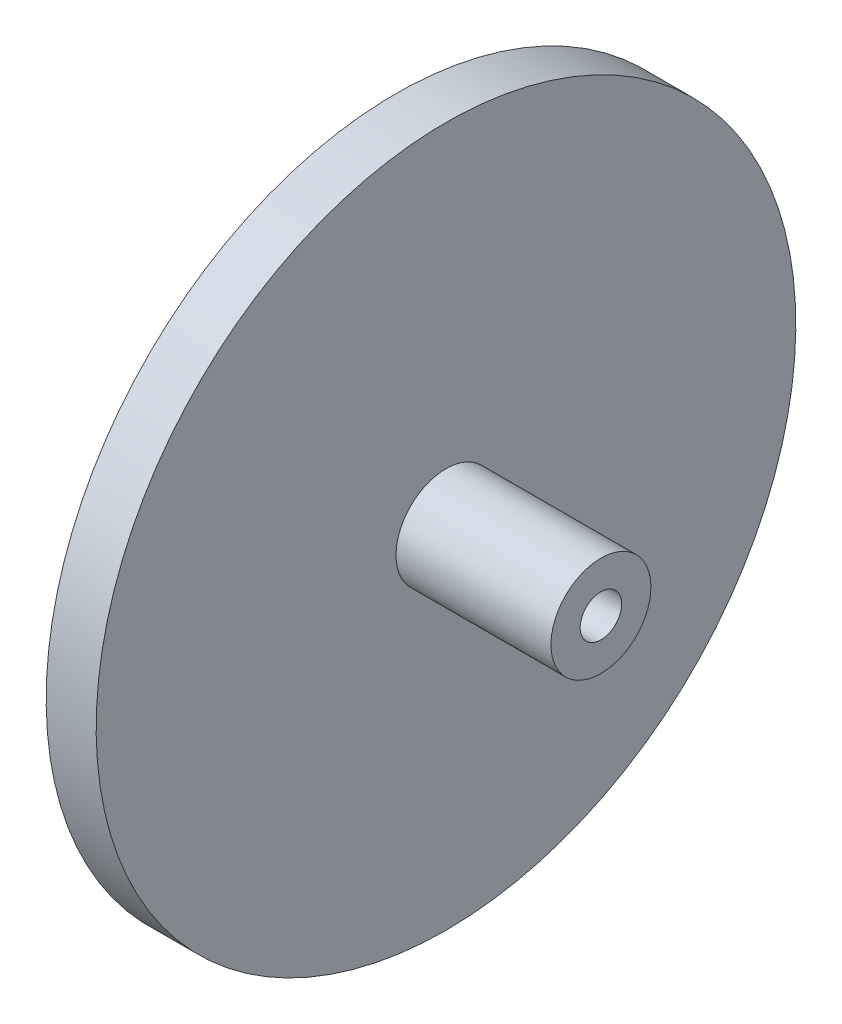
ISO-10303-21;
HEADER;
FILE_DESCRIPTION(('STEP AP214'),'2;1');
FILE_NAME('part.step','',(''),(''),'','','');
FILE_SCHEMA(('AUTOMOTIVE_DESIGN { 1 0 10303 214 1 1 1 1 }'));
ENDSEC;
DATA;
#1=APPLICATION_CONTEXT('core data for automotive mechanical design processes');
#2=APPLICATION_PROTOCOL_DEFINITION('international standard','automotive_design',2000,#1);
#3=PRODUCT_CONTEXT('',#1,'mechanical');
#4=PRODUCT('Part','Part','',(#3));
#5=PRODUCT_RELATED_PRODUCT_CATEGORY('part','',(#4));
#6=PRODUCT_DEFINITION_FORMATION('','',#4);
#7=PRODUCT_DEFINITION_CONTEXT('part definition',#1,'design');
#8=PRODUCT_DEFINITION('design','',#6,#7);
#9=PRODUCT_DEFINITION_SHAPE('','',#8);
#10=(LENGTH_UNIT() NAMED_UNIT(*) SI_UNIT(.MILLI.,.METRE.));
#11=(NAMED_UNIT(*) PLANE_ANGLE_UNIT() SI_UNIT($,.RADIAN.));
#12=(NAMED_UNIT(*) SI_UNIT($,.STERADIAN.) SOLID_ANGLE_UNIT());
#13=UNCERTAINTY_MEASURE_WITH_UNIT(LENGTH_MEASURE(1.E-05),#10,'distance_accuracy_value','');
#14=(GEOMETRIC_REPRESENTATION_CONTEXT(3) GLOBAL_UNCERTAINTY_ASSIGNED_CONTEXT((#13)) GLOBAL_UNIT_ASSIGNED_CONTEXT((#10,
#11,#12)) REPRESENTATION_CONTEXT('',''));
#15=CARTESIAN_POINT('',(0.,0.,0.));
#16=DIRECTION('',(0.,0.,1.));
#17=DIRECTION('',(1.,0.,0.));
#18=AXIS2_PLACEMENT_3D('',#15,#16,#17);
#19=CARTESIAN_POINT('',(41.91,44.45,0.));
#20=DIRECTION('',(1.,0.,0.));
#21=DIRECTION('',(0.,1.,0.));
#22=AXIS2_PLACEMENT_3D('',#19,#20,#21);
#23=PLANE('',#22);
#24=CARTESIAN_POINT('',(41.91,0.,0.));
#25=DIRECTION('',(1.,0.,0.));
#26=DIRECTION('',(0.,1.,0.));
#27=AXIS2_PLACEMENT_3D('',#24,#25,#26);
#28=CIRCLE('',#27,2.6416);
#29=CARTESIAN_POINT('',(41.91,2.6416,0.));
#30=VERTEX_POINT('',#29);
#31=EDGE_CURVE('E60',#30,#30,#28,.T.);
#32=ORIENTED_EDGE('',*,*,#31,.T.);
#33=EDGE_LOOP('',(#32));
#34=FACE_BOUND('',#33,.T.);
#35=CARTESIAN_POINT('',(41.91,0.,0.));
#36=DIRECTION('',(-1.,0.,0.));
#37=DIRECTION('',(0.,-1.,0.));
#38=AXIS2_PLACEMENT_3D('',#35,#36,#37);
#39=CIRCLE('',#38,44.45);
#40=CARTESIAN_POINT('',(41.91,-44.45,0.));
#41=VERTEX_POINT('',#40);
#42=EDGE_CURVE('E10',#41,#41,#39,.T.);
#43=ORIENTED_EDGE('',*,*,#42,.T.);
#44=EDGE_LOOP('',(#43));
#45=FACE_BOUND('',#44,.T.);
#46=ADVANCED_FACE('F37',(#34,#45),#23,.F.);
#47=CARTESIAN_POINT('',(41.91,0.,0.));
#48=DIRECTION('',(-1.,0.,0.));
#49=DIRECTION('',(0.,-1.,0.));
#50=AXIS2_PLACEMENT_3D('',#47,#48,#49);
#51=CYLINDRICAL_SURFACE('',#50,44.45);
#52=ORIENTED_EDGE('',*,*,#42,.F.);
#53=EDGE_LOOP('',(#52));
#54=FACE_BOUND('',#53,.T.);
#55=CARTESIAN_POINT('',(48.26,0.,0.));
#56=DIRECTION('',(-1.,0.,0.));
#57=DIRECTION('',(0.,-1.,0.));
#58=AXIS2_PLACEMENT_3D('',#55,#56,#57);
#59=CIRCLE('',#58,44.45);
#60=CARTESIAN_POINT('',(48.26,-44.45,0.));
#61=VERTEX_POINT('',#60);
#62=EDGE_CURVE('E44',#61,#61,#59,.T.);
#63=ORIENTED_EDGE('',*,*,#62,.T.);
#64=EDGE_LOOP('',(#63));
#65=FACE_BOUND('',#64,.T.);
#66=ADVANCED_FACE('F90',(#54,#65),#51,.T.);
#67=CARTESIAN_POINT('',(48.26,44.45,0.));
#68=DIRECTION('',(-1.,0.,0.));
#69=DIRECTION('',(0.,-1.,0.));
#70=AXIS2_PLACEMENT_3D('',#67,#68,#69);
#71=PLANE('',#70);
#72=ORIENTED_EDGE('',*,*,#62,.F.);
#73=EDGE_LOOP('',(#72));
#74=FACE_BOUND('',#73,.T.);
#75=CARTESIAN_POINT('',(48.26,0.,0.));
#76=DIRECTION('',(-1.,0.,0.));
#77=DIRECTION('',(0.,-1.,0.));
#78=AXIS2_PLACEMENT_3D('',#75,#76,#77);
#79=CIRCLE('',#78,6.35000000000002);
#80=CARTESIAN_POINT('',(48.26,-6.35000000000002,0.));
#81=VERTEX_POINT('',#80);
#82=EDGE_CURVE('E49',#81,#81,#79,.T.);
#83=ORIENTED_EDGE('',*,*,#82,.T.);
#84=EDGE_LOOP('',(#83));
#85=FACE_BOUND('',#84,.T.);
#86=ADVANCED_FACE('F84',(#74,#85),#71,.F.);
#87=CARTESIAN_POINT('',(41.91,0.,0.));
#88=DIRECTION('',(-1.,0.,0.));
#89=DIRECTION('',(0.,-1.,0.));
#90=AXIS2_PLACEMENT_3D('',#87,#88,#89);
#91=CYLINDRICAL_SURFACE('',#90,6.35000000000002);
#92=ORIENTED_EDGE('',*,*,#82,.F.);
#93=EDGE_LOOP('',(#92));
#94=FACE_BOUND('',#93,.T.);
#95=CARTESIAN_POINT('',(67.945,0.,0.));
#96=DIRECTION('',(-1.,0.,0.));
#97=DIRECTION('',(0.,-1.,0.));
#98=AXIS2_PLACEMENT_3D('',#95,#96,#97);
#99=CIRCLE('',#98,6.35000000000002);
#100=CARTESIAN_POINT('',(67.945,-6.35000000000002,0.));
#101=VERTEX_POINT('',#100);
#102=EDGE_CURVE('E54',#101,#101,#99,.T.);
#103=ORIENTED_EDGE('',*,*,#102,.T.);
#104=EDGE_LOOP('',(#103));
#105=FACE_BOUND('',#104,.T.);
#106=ADVANCED_FACE('F79',(#94,#105),#91,.T.);
#107=CARTESIAN_POINT('',(67.945,6.35000000000003,0.));
#108=DIRECTION('',(-1.,0.,0.));
#109=DIRECTION('',(0.,-1.,0.));
#110=AXIS2_PLACEMENT_3D('',#107,#108,#109);
#111=PLANE('',#110);
#112=CARTESIAN_POINT('',(67.945,0.,0.));
#113=DIRECTION('',(1.,0.,0.));
#114=DIRECTION('',(0.,1.,0.));
#115=AXIS2_PLACEMENT_3D('',#112,#113,#114);
#116=CIRCLE('',#115,2.6416);
#117=CARTESIAN_POINT('',(67.945,2.6416,0.));
#118=VERTEX_POINT('',#117);
#119=EDGE_CURVE('E61',#118,#118,#116,.T.);
#120=ORIENTED_EDGE('',*,*,#119,.F.);
#121=EDGE_LOOP('',(#120));
#122=FACE_BOUND('',#121,.T.);
#123=ORIENTED_EDGE('',*,*,#102,.F.);
#124=EDGE_LOOP('',(#123));
#125=FACE_BOUND('',#124,.T.);
#126=ADVANCED_FACE('F73',(#122,#125),#111,.F.);
#127=CARTESIAN_POINT('',(41.91,0.,0.));
#128=DIRECTION('',(1.,0.,0.));
#129=DIRECTION('',(0.,1.,0.));
#130=AXIS2_PLACEMENT_3D('',#127,#128,#129);
#131=CYLINDRICAL_SURFACE('',#130,2.6416);
#132=CARTESIAN_POINT('',(41.91,2.6416,0.));
#133=CARTESIAN_POINT('',(42.1811979166666,2.6416,0.));
#134=CARTESIAN_POINT('',(42.4523958333333,2.6416,0.));
#135=CARTESIAN_POINT('',(42.9947916666666,2.6416,0.));
#136=CARTESIAN_POINT('',(43.2659895833333,2.6416,0.));
#137=CARTESIAN_POINT('',(43.8083854166666,2.6416,0.));
#138=CARTESIAN_POINT('',(44.0795833333333,2.6416,0.));
#139=CARTESIAN_POINT('',(44.6219791666666,2.6416,0.));
#140=CARTESIAN_POINT('',(44.8931770833333,2.6416,0.));
#141=CARTESIAN_POINT('',(45.4355729166666,2.6416,0.));
#142=CARTESIAN_POINT('',(45.7067708333333,2.6416,0.));
#143=CARTESIAN_POINT('',(46.2491666666666,2.6416,0.));
#144=CARTESIAN_POINT('',(46.5203645833333,2.6416,0.));
#145=CARTESIAN_POINT('',(47.0627604166666,2.6416,0.));
#146=CARTESIAN_POINT('',(47.3339583333333,2.6416,0.));
#147=CARTESIAN_POINT('',(47.8763541666667,2.6416,0.));
#148=CARTESIAN_POINT('',(48.1475520833333,2.6416,0.));
#149=CARTESIAN_POINT('',(48.6899479166666,2.6416,0.));
#150=CARTESIAN_POINT('',(48.9611458333333,2.6416,0.));
#151=CARTESIAN_POINT('',(49.5035416666666,2.6416,0.));
#152=CARTESIAN_POINT('',(49.7747395833333,2.6416,0.));
#153=CARTESIAN_POINT('',(50.3171354166667,2.6416,0.));
#154=CARTESIAN_POINT('',(50.5883333333333,2.6416,0.));
#155=CARTESIAN_POINT('',(51.1307291666666,2.6416,0.));
#156=CARTESIAN_POINT('',(51.4019270833333,2.6416,0.));
#157=CARTESIAN_POINT('',(51.9443229166666,2.6416,0.));
#158=CARTESIAN_POINT('',(52.2155208333333,2.6416,0.));
#159=CARTESIAN_POINT('',(52.7579166666666,2.6416,0.));
#160=CARTESIAN_POINT('',(53.0291145833333,2.6416,0.));
#161=CARTESIAN_POINT('',(53.5715104166666,2.6416,0.));
#162=CARTESIAN_POINT('',(53.8427083333333,2.6416,0.));
#163=CARTESIAN_POINT('',(54.3851041666667,2.6416,0.));
#164=CARTESIAN_POINT('',(54.6563020833333,2.6416,0.));
#165=CARTESIAN_POINT('',(55.1986979166667,2.6416,0.));
#166=CARTESIAN_POINT('',(55.4698958333333,2.6416,0.));
#167=CARTESIAN_POINT('',(56.0122916666666,2.6416,0.));
#168=CARTESIAN_POINT('',(56.2834895833333,2.6416,0.));
#169=CARTESIAN_POINT('',(56.8258854166667,2.6416,0.));
#170=CARTESIAN_POINT('',(57.0970833333333,2.6416,0.));
#171=CARTESIAN_POINT('',(57.6394791666667,2.6416,0.));
#172=CARTESIAN_POINT('',(57.9106770833333,2.6416,0.));
#173=CARTESIAN_POINT('',(58.4530729166666,2.6416,0.));
#174=CARTESIAN_POINT('',(58.7242708333333,2.6416,0.));
#175=CARTESIAN_POINT('',(59.2666666666667,2.6416,0.));
#176=CARTESIAN_POINT('',(59.5378645833333,2.6416,0.));
#177=CARTESIAN_POINT('',(60.0802604166666,2.6416,0.));
#178=CARTESIAN_POINT('',(60.3514583333333,2.6416,0.));
#179=CARTESIAN_POINT('',(60.8938541666666,2.6416,0.));
#180=CARTESIAN_POINT('',(61.1650520833333,2.6416,0.));
#181=CARTESIAN_POINT('',(61.7074479166667,2.6416,0.));
#182=CARTESIAN_POINT('',(61.9786458333333,2.6416,0.));
#183=CARTESIAN_POINT('',(62.5210416666667,2.6416,0.));
#184=CARTESIAN_POINT('',(62.7922395833333,2.6416,0.));
#185=CARTESIAN_POINT('',(63.3346354166667,2.6416,0.));
#186=CARTESIAN_POINT('',(63.6058333333333,2.6416,0.));
#187=CARTESIAN_POINT('',(64.1482291666667,2.6416,0.));
#188=CARTESIAN_POINT('',(64.4194270833333,2.6416,0.));
#189=CARTESIAN_POINT('',(64.9618229166666,2.6416,0.));
#190=CARTESIAN_POINT('',(65.2330208333333,2.6416,0.));
#191=CARTESIAN_POINT('',(65.7754166666667,2.6416,0.));
#192=CARTESIAN_POINT('',(66.0466145833333,2.6416,0.));
#193=CARTESIAN_POINT('',(66.5890104166667,2.6416,0.));
#194=CARTESIAN_POINT('',(66.8602083333333,2.6416,0.));
#195=CARTESIAN_POINT('',(67.4026041666667,2.6416,0.));
#196=CARTESIAN_POINT('',(67.6738020833333,2.6416,0.));
#197=CARTESIAN_POINT('',(67.945,2.6416,0.));
#198=B_SPLINE_CURVE_WITH_KNOTS('',3,(#132,#133,#134,#135,#136,#137,#138,#139,#140,#141,#142,
#143,#144,#145,#146,#147,#148,#149,#150,#151,#152,#153,#154,#155,#156,#157,#158,#159,#160,#161,
#162,#163,#164,#165,#166,#167,#168,#169,#170,#171,#172,#173,#174,#175,#176,#177,#178,#179,#180,
#181,#182,#183,#184,#185,#186,#187,#188,#189,#190,#191,#192,#193,#194,#195,#196,#197),
.UNSPECIFIED.,.F.,.F.,(4,2,2,2,2,2,2,2,2,2,2,2,2,2,2,2,2,2,2,2,2,2,2,2,2,2,2,2,2,2,2,2,4),(0.,
0.813593750000001,1.6271875,2.44078125,3.254375,4.06796875,4.88156250000001,5.69515625000001,
6.50875000000001,7.32234375000001,8.13593750000001,8.94953125,9.763125,10.57671875,11.3903125,
12.20390625,13.0175,13.83109375,14.6446875,15.45828125,16.271875,17.08546875,17.8990625,
18.71265625,19.52625,20.33984375,21.1534375,21.96703125,22.780625,23.59421875,24.4078125,
25.22140625,26.035),.UNSPECIFIED.);
#199=EDGE_CURVE('BSEAM70',#30,#118,#198,.T.);
#200=ORIENTED_EDGE('',*,*,#31,.F.);
#201=ORIENTED_EDGE('',*,*,#119,.T.);
#202=ORIENTED_EDGE('',*,*,#199,.T.);
#203=ORIENTED_EDGE('',*,*,#199,.F.);
#204=EDGE_LOOP('',(#200,#202,#201,#203));
#205=FACE_BOUND('',#204,.T.);
#206=ADVANCED_FACE('F70',(#205),#131,.F.);
#207=CLOSED_SHELL('',(#46,#66,#86,#106,#126,#206));
#208=MANIFOLD_SOLID_BREP('B2',#207);
#209=ADVANCED_BREP_SHAPE_REPRESENTATION('',(#18,#208),#14);
#210=SHAPE_DEFINITION_REPRESENTATION(#9,#209);
ENDSEC;
END-ISO-10303-21;
